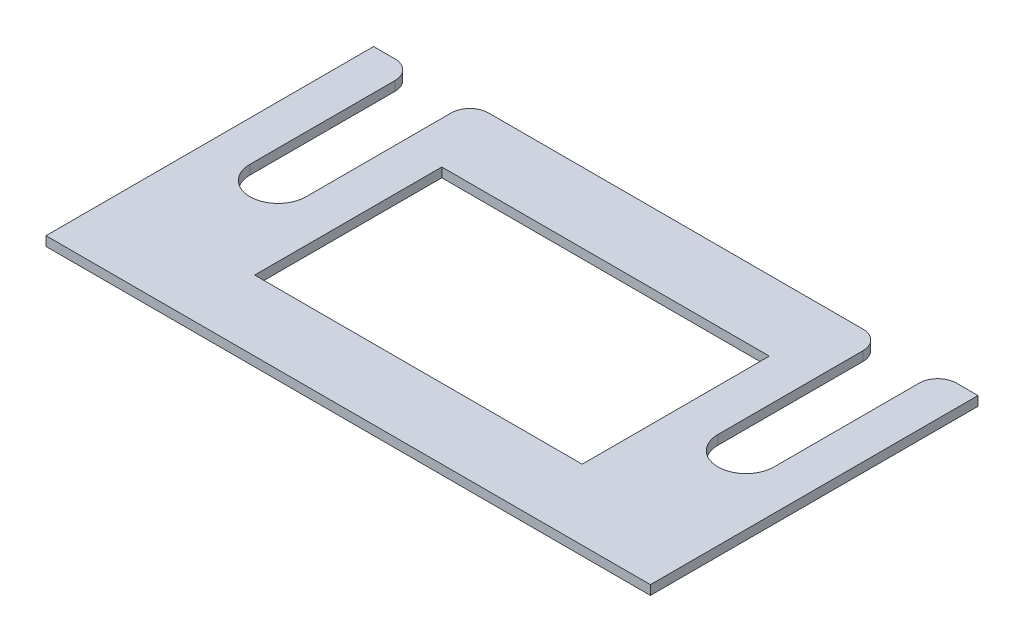
ISO-10303-21;
HEADER;
FILE_DESCRIPTION(('STEP AP214'),'2;1');
FILE_NAME('part.step','',(''),(''),'','','');
FILE_SCHEMA(('AUTOMOTIVE_DESIGN { 1 0 10303 214 1 1 1 1 }'));
ENDSEC;
DATA;
#1=APPLICATION_CONTEXT('core data for automotive mechanical design processes');
#2=APPLICATION_PROTOCOL_DEFINITION('international standard','automotive_design',2000,#1);
#3=PRODUCT_CONTEXT('',#1,'mechanical');
#4=PRODUCT('Part','Part','',(#3));
#5=PRODUCT_RELATED_PRODUCT_CATEGORY('part','',(#4));
#6=PRODUCT_DEFINITION_FORMATION('','',#4);
#7=PRODUCT_DEFINITION_CONTEXT('part definition',#1,'design');
#8=PRODUCT_DEFINITION('design','',#6,#7);
#9=PRODUCT_DEFINITION_SHAPE('','',#8);
#10=(LENGTH_UNIT() NAMED_UNIT(*) SI_UNIT(.MILLI.,.METRE.));
#11=(NAMED_UNIT(*) PLANE_ANGLE_UNIT() SI_UNIT($,.RADIAN.));
#12=(NAMED_UNIT(*) SI_UNIT($,.STERADIAN.) SOLID_ANGLE_UNIT());
#13=UNCERTAINTY_MEASURE_WITH_UNIT(LENGTH_MEASURE(1.E-05),#10,'distance_accuracy_value','');
#14=(GEOMETRIC_REPRESENTATION_CONTEXT(3) GLOBAL_UNCERTAINTY_ASSIGNED_CONTEXT((#13)) GLOBAL_UNIT_ASSIGNED_CONTEXT((#10,
#11,#12)) REPRESENTATION_CONTEXT('',''));
#15=CARTESIAN_POINT('',(0.,0.,0.));
#16=DIRECTION('',(0.,0.,1.));
#17=DIRECTION('',(1.,0.,0.));
#18=AXIS2_PLACEMENT_3D('',#15,#16,#17);
#19=CARTESIAN_POINT('',(-32.29,1.,-17.5));
#20=DIRECTION('',(0.,0.,1.));
#21=DIRECTION('',(1.,0.,0.));
#22=AXIS2_PLACEMENT_3D('',#19,#20,#21);
#23=PLANE('',#22);
#24=DIRECTION('',(-1.,0.,0.));
#25=VECTOR('',#24,1.);
#26=CARTESIAN_POINT('',(-32.29,1.,-17.5));
#27=LINE('',#26,#25);
#28=CARTESIAN_POINT('',(20.,1.,-17.5));
#29=VERTEX_POINT('',#28);
#30=CARTESIAN_POINT('',(-20.,1.,-17.5));
#31=VERTEX_POINT('',#30);
#32=EDGE_CURVE('E271',#29,#31,#27,.T.);
#33=ORIENTED_EDGE('',*,*,#32,.F.);
#34=DIRECTION('',(0.,1.,0.));
#35=VECTOR('',#34,1.);
#36=CARTESIAN_POINT('',(20.,1.,-17.5));
#37=LINE('',#36,#35);
#38=CARTESIAN_POINT('',(20.,0.,-17.5));
#39=VERTEX_POINT('',#38);
#40=EDGE_CURVE('E198',#29,#39,#37,.F.);
#41=ORIENTED_EDGE('',*,*,#40,.T.);
#42=DIRECTION('',(-1.,0.,0.));
#43=VECTOR('',#42,1.);
#44=CARTESIAN_POINT('',(-32.29,0.,-17.5));
#45=LINE('',#44,#43);
#46=CARTESIAN_POINT('',(-20.,0.,-17.5));
#47=VERTEX_POINT('',#46);
#48=EDGE_CURVE('E284',#39,#47,#45,.T.);
#49=ORIENTED_EDGE('',*,*,#48,.T.);
#50=DIRECTION('',(0.,1.,0.));
#51=VECTOR('',#50,1.);
#52=CARTESIAN_POINT('',(-20.,1.,-17.5));
#53=LINE('',#52,#51);
#54=EDGE_CURVE('E200',#47,#31,#53,.T.);
#55=ORIENTED_EDGE('',*,*,#54,.T.);
#56=EDGE_LOOP('',(#33,#41,#49,#55));
#57=FACE_BOUND('',#56,.T.);
#58=ADVANCED_FACE('F37',(#57),#23,.F.);
#59=CARTESIAN_POINT('',(32.29,0.,-17.5));
#60=VERTEX_POINT('',#59);
#61=CARTESIAN_POINT('',(30.,0.,-17.5));
#62=VERTEX_POINT('',#61);
#63=EDGE_CURVE('E280',#60,#62,#45,.T.);
#64=ORIENTED_EDGE('',*,*,#63,.T.);
#65=DIRECTION('',(0.,1.,0.));
#66=VECTOR('',#65,1.);
#67=CARTESIAN_POINT('',(30.,1.,-17.5));
#68=LINE('',#67,#66);
#69=CARTESIAN_POINT('',(30.,1.,-17.5));
#70=VERTEX_POINT('',#69);
#71=EDGE_CURVE('E224',#62,#70,#68,.T.);
#72=ORIENTED_EDGE('',*,*,#71,.T.);
#73=CARTESIAN_POINT('',(32.29,1.,-17.5));
#74=VERTEX_POINT('',#73);
#75=EDGE_CURVE('E267',#74,#70,#27,.T.);
#76=ORIENTED_EDGE('',*,*,#75,.F.);
#77=DIRECTION('',(0.,-1.,0.));
#78=VECTOR('',#77,1.);
#79=CARTESIAN_POINT('',(32.29,1.,-17.5));
#80=LINE('',#79,#78);
#81=EDGE_CURVE('E295',#74,#60,#80,.T.);
#82=ORIENTED_EDGE('',*,*,#81,.T.);
#83=EDGE_LOOP('',(#64,#72,#76,#82));
#84=FACE_BOUND('',#83,.T.);
#85=ADVANCED_FACE('F308',(#84),#23,.F.);
#86=CARTESIAN_POINT('',(0.,1.,0.));
#87=DIRECTION('',(0.,-1.,0.));
#88=DIRECTION('',(0.,0.,-1.));
#89=AXIS2_PLACEMENT_3D('',#86,#87,#88);
#90=PLANE('',#89);
#91=DIRECTION('',(-1.,0.,0.));
#92=VECTOR('',#91,1.);
#93=CARTESIAN_POINT('',(0.,1.,10.));
#94=LINE('',#93,#92);
#95=CARTESIAN_POINT('',(17.5,1.,10.));
#96=VERTEX_POINT('',#95);
#97=CARTESIAN_POINT('',(-17.5,1.,10.));
#98=VERTEX_POINT('',#97);
#99=EDGE_CURVE('E359',#96,#98,#94,.T.);
#100=ORIENTED_EDGE('',*,*,#99,.T.);
#101=DIRECTION('',(0.,0.,-1.));
#102=VECTOR('',#101,1.);
#103=CARTESIAN_POINT('',(-17.5,1.,0.));
#104=LINE('',#103,#102);
#105=CARTESIAN_POINT('',(-17.5,1.,-10.));
#106=VERTEX_POINT('',#105);
#107=EDGE_CURVE('E353',#98,#106,#104,.T.);
#108=ORIENTED_EDGE('',*,*,#107,.T.);
#109=DIRECTION('',(1.,0.,0.));
#110=VECTOR('',#109,1.);
#111=CARTESIAN_POINT('',(0.,1.,-10.));
#112=LINE('',#111,#110);
#113=CARTESIAN_POINT('',(17.5,1.,-9.99999999999999));
#114=VERTEX_POINT('',#113);
#115=EDGE_CURVE('E363',#106,#114,#112,.T.);
#116=ORIENTED_EDGE('',*,*,#115,.T.);
#117=DIRECTION('',(0.,0.,1.));
#118=VECTOR('',#117,1.);
#119=CARTESIAN_POINT('',(17.5,1.,0.));
#120=LINE('',#119,#118);
#121=EDGE_CURVE('E183',#114,#96,#120,.T.);
#122=ORIENTED_EDGE('',*,*,#121,.T.);
#123=EDGE_LOOP('',(#100,#108,#116,#122));
#124=FACE_BOUND('',#123,.T.);
#125=ORIENTED_EDGE('',*,*,#75,.T.);
#126=CARTESIAN_POINT('',(30.,1.,-15.5));
#127=DIRECTION('',(0.,-1.,0.));
#128=DIRECTION('',(0.,0.,-1.));
#129=AXIS2_PLACEMENT_3D('',#126,#127,#128);
#130=CIRCLE('',#129,2.);
#131=CARTESIAN_POINT('',(28.,1.,-15.5));
#132=VERTEX_POINT('',#131);
#133=EDGE_CURVE('E216',#70,#132,#130,.F.);
#134=ORIENTED_EDGE('',*,*,#133,.T.);
#135=DIRECTION('',(0.,0.,1.));
#136=VECTOR('',#135,1.);
#137=CARTESIAN_POINT('',(28.,1.,0.));
#138=LINE('',#137,#136);
#139=CARTESIAN_POINT('',(28.,1.00001125,0.));
#140=VERTEX_POINT('',#139);
#141=EDGE_CURVE('E225',#132,#140,#138,.T.);
#142=ORIENTED_EDGE('',*,*,#141,.T.);
#143=CARTESIAN_POINT('',(25.,1.,0.));
#144=DIRECTION('',(0.,1.,0.));
#145=DIRECTION('',(0.,0.,1.));
#146=AXIS2_PLACEMENT_3D('',#143,#144,#145);
#147=CIRCLE('',#146,3.);
#148=CARTESIAN_POINT('',(22.,1.00001125,0.));
#149=VERTEX_POINT('',#148);
#150=EDGE_CURVE('E257',#149,#140,#147,.T.);
#151=ORIENTED_EDGE('',*,*,#150,.F.);
#152=DIRECTION('',(0.,0.,-1.));
#153=VECTOR('',#152,1.);
#154=CARTESIAN_POINT('',(22.,1.,0.));
#155=LINE('',#154,#153);
#156=CARTESIAN_POINT('',(22.,1.,-15.5));
#157=VERTEX_POINT('',#156);
#158=EDGE_CURVE('E229',#149,#157,#155,.T.);
#159=ORIENTED_EDGE('',*,*,#158,.T.);
#160=CARTESIAN_POINT('',(20.,1.,-15.5));
#161=DIRECTION('',(0.,-1.,0.));
#162=DIRECTION('',(0.,0.,-1.));
#163=AXIS2_PLACEMENT_3D('',#160,#161,#162);
#164=CIRCLE('',#163,2.);
#165=EDGE_CURVE('E218',#157,#29,#164,.F.);
#166=ORIENTED_EDGE('',*,*,#165,.T.);
#167=ORIENTED_EDGE('',*,*,#32,.T.);
#168=CARTESIAN_POINT('',(-20.,1.,-15.5));
#169=DIRECTION('',(0.,-1.,0.));
#170=DIRECTION('',(0.,0.,-1.));
#171=AXIS2_PLACEMENT_3D('',#168,#169,#170);
#172=CIRCLE('',#171,2.);
#173=CARTESIAN_POINT('',(-22.,1.,-15.5));
#174=VERTEX_POINT('',#173);
#175=EDGE_CURVE('E222',#31,#174,#172,.F.);
#176=ORIENTED_EDGE('',*,*,#175,.T.);
#177=DIRECTION('',(0.,0.,1.));
#178=VECTOR('',#177,1.);
#179=CARTESIAN_POINT('',(-22.,1.,0.));
#180=LINE('',#179,#178);
#181=CARTESIAN_POINT('',(-22.,1.00001125,0.));
#182=VERTEX_POINT('',#181);
#183=EDGE_CURVE('E230',#174,#182,#180,.T.);
#184=ORIENTED_EDGE('',*,*,#183,.T.);
#185=CARTESIAN_POINT('',(-25.,1.,0.));
#186=DIRECTION('',(0.,1.,0.));
#187=DIRECTION('',(0.,0.,1.));
#188=AXIS2_PLACEMENT_3D('',#185,#186,#187);
#189=CIRCLE('',#188,3.);
#190=CARTESIAN_POINT('',(-28.,1.00001125,0.));
#191=VERTEX_POINT('',#190);
#192=EDGE_CURVE('E261',#191,#182,#189,.T.);
#193=ORIENTED_EDGE('',*,*,#192,.F.);
#194=DIRECTION('',(0.,0.,-1.));
#195=VECTOR('',#194,1.);
#196=CARTESIAN_POINT('',(-28.,1.,0.));
#197=LINE('',#196,#195);
#198=CARTESIAN_POINT('',(-28.,1.,-15.5));
#199=VERTEX_POINT('',#198);
#200=EDGE_CURVE('E228',#191,#199,#197,.T.);
#201=ORIENTED_EDGE('',*,*,#200,.T.);
#202=CARTESIAN_POINT('',(-30.,1.,-15.5));
#203=DIRECTION('',(0.,-1.,0.));
#204=DIRECTION('',(0.,0.,-1.));
#205=AXIS2_PLACEMENT_3D('',#202,#203,#204);
#206=CIRCLE('',#205,2.);
#207=CARTESIAN_POINT('',(-30.,1.,-17.5));
#208=VERTEX_POINT('',#207);
#209=EDGE_CURVE('E220',#199,#208,#206,.F.);
#210=ORIENTED_EDGE('',*,*,#209,.T.);
#211=CARTESIAN_POINT('',(-32.29,1.,-17.5));
#212=VERTEX_POINT('',#211);
#213=EDGE_CURVE('E265',#208,#212,#27,.T.);
#214=ORIENTED_EDGE('',*,*,#213,.T.);
#215=DIRECTION('',(0.,0.,1.));
#216=VECTOR('',#215,1.);
#217=CARTESIAN_POINT('',(-32.29,1.,17.5));
#218=LINE('',#217,#216);
#219=CARTESIAN_POINT('',(-32.29,1.,17.5));
#220=VERTEX_POINT('',#219);
#221=EDGE_CURVE('E270',#212,#220,#218,.T.);
#222=ORIENTED_EDGE('',*,*,#221,.T.);
#223=DIRECTION('',(1.,0.,0.));
#224=VECTOR('',#223,1.);
#225=CARTESIAN_POINT('',(-32.29,1.,17.5));
#226=LINE('',#225,#224);
#227=CARTESIAN_POINT('',(32.29,1.,17.5));
#228=VERTEX_POINT('',#227);
#229=EDGE_CURVE('E273',#220,#228,#226,.T.);
#230=ORIENTED_EDGE('',*,*,#229,.T.);
#231=DIRECTION('',(0.,0.,-1.));
#232=VECTOR('',#231,1.);
#233=CARTESIAN_POINT('',(32.29,1.,17.5));
#234=LINE('',#233,#232);
#235=EDGE_CURVE('E262',#228,#74,#234,.T.);
#236=ORIENTED_EDGE('',*,*,#235,.T.);
#237=EDGE_LOOP('',(#125,#134,#142,#151,#159,#166,#167,#176,#184,#193,#201,#210,#214,#222,#230,#236));
#238=FACE_BOUND('',#237,.T.);
#239=ADVANCED_FACE('F312',(#124,#238),#90,.F.);
#240=CARTESIAN_POINT('',(0.,0.,0.));
#241=DIRECTION('',(0.,-1.,0.));
#242=DIRECTION('',(0.,0.,-1.));
#243=AXIS2_PLACEMENT_3D('',#240,#241,#242);
#244=PLANE('',#243);
#245=DIRECTION('',(0.,0.,-1.));
#246=VECTOR('',#245,1.);
#247=CARTESIAN_POINT('',(-17.5,0.,0.));
#248=LINE('',#247,#246);
#249=CARTESIAN_POINT('',(-17.5,0.,10.));
#250=VERTEX_POINT('',#249);
#251=CARTESIAN_POINT('',(-17.5,0.,-10.));
#252=VERTEX_POINT('',#251);
#253=EDGE_CURVE('E11',#250,#252,#248,.T.);
#254=ORIENTED_EDGE('',*,*,#253,.F.);
#255=DIRECTION('',(-1.,0.,0.));
#256=VECTOR('',#255,1.);
#257=CARTESIAN_POINT('',(0.,0.,10.));
#258=LINE('',#257,#256);
#259=CARTESIAN_POINT('',(17.5,0.,10.));
#260=VERTEX_POINT('',#259);
#261=EDGE_CURVE('E45',#260,#250,#258,.T.);
#262=ORIENTED_EDGE('',*,*,#261,.F.);
#263=DIRECTION('',(0.,0.,1.));
#264=VECTOR('',#263,1.);
#265=CARTESIAN_POINT('',(17.5,0.,0.));
#266=LINE('',#265,#264);
#267=CARTESIAN_POINT('',(17.5,0.,-9.99999999999999));
#268=VERTEX_POINT('',#267);
#269=EDGE_CURVE('E175',#268,#260,#266,.T.);
#270=ORIENTED_EDGE('',*,*,#269,.F.);
#271=DIRECTION('',(1.,0.,0.));
#272=VECTOR('',#271,1.);
#273=CARTESIAN_POINT('',(0.,0.,-10.));
#274=LINE('',#273,#272);
#275=EDGE_CURVE('E170',#252,#268,#274,.T.);
#276=ORIENTED_EDGE('',*,*,#275,.F.);
#277=EDGE_LOOP('',(#254,#262,#270,#276));
#278=FACE_BOUND('',#277,.T.);
#279=DIRECTION('',(0.,0.,-1.));
#280=VECTOR('',#279,1.);
#281=CARTESIAN_POINT('',(28.,0.,0.));
#282=LINE('',#281,#280);
#283=CARTESIAN_POINT('',(28.,0.,0.));
#284=VERTEX_POINT('',#283);
#285=CARTESIAN_POINT('',(28.,0.,-15.5));
#286=VERTEX_POINT('',#285);
#287=EDGE_CURVE('E324',#284,#286,#282,.T.);
#288=ORIENTED_EDGE('',*,*,#287,.T.);
#289=CARTESIAN_POINT('',(30.,0.,-15.5));
#290=DIRECTION('',(0.,-1.,0.));
#291=DIRECTION('',(0.,0.,-1.));
#292=AXIS2_PLACEMENT_3D('',#289,#290,#291);
#293=CIRCLE('',#292,2.);
#294=EDGE_CURVE('E206',#286,#62,#293,.T.);
#295=ORIENTED_EDGE('',*,*,#294,.T.);
#296=ORIENTED_EDGE('',*,*,#63,.F.);
#297=DIRECTION('',(0.,0.,-1.));
#298=VECTOR('',#297,1.);
#299=CARTESIAN_POINT('',(32.29,0.,17.5));
#300=LINE('',#299,#298);
#301=CARTESIAN_POINT('',(32.29,0.,17.5));
#302=VERTEX_POINT('',#301);
#303=EDGE_CURVE('E276',#302,#60,#300,.T.);
#304=ORIENTED_EDGE('',*,*,#303,.F.);
#305=DIRECTION('',(1.,0.,0.));
#306=VECTOR('',#305,1.);
#307=CARTESIAN_POINT('',(-32.29,0.,17.5));
#308=LINE('',#307,#306);
#309=CARTESIAN_POINT('',(-32.29,0.,17.5));
#310=VERTEX_POINT('',#309);
#311=EDGE_CURVE('E266',#310,#302,#308,.T.);
#312=ORIENTED_EDGE('',*,*,#311,.F.);
#313=DIRECTION('',(0.,0.,1.));
#314=VECTOR('',#313,1.);
#315=CARTESIAN_POINT('',(-32.29,0.,17.5));
#316=LINE('',#315,#314);
#317=CARTESIAN_POINT('',(-32.29,0.,-17.5));
#318=VERTEX_POINT('',#317);
#319=EDGE_CURVE('E283',#318,#310,#316,.T.);
#320=ORIENTED_EDGE('',*,*,#319,.F.);
#321=CARTESIAN_POINT('',(-30.,0.,-17.5));
#322=VERTEX_POINT('',#321);
#323=EDGE_CURVE('E279',#322,#318,#45,.T.);
#324=ORIENTED_EDGE('',*,*,#323,.F.);
#325=CARTESIAN_POINT('',(-30.,0.,-15.5));
#326=DIRECTION('',(0.,-1.,0.));
#327=DIRECTION('',(0.,0.,-1.));
#328=AXIS2_PLACEMENT_3D('',#325,#326,#327);
#329=CIRCLE('',#328,2.);
#330=CARTESIAN_POINT('',(-28.,0.,-15.5));
#331=VERTEX_POINT('',#330);
#332=EDGE_CURVE('E210',#322,#331,#329,.T.);
#333=ORIENTED_EDGE('',*,*,#332,.T.);
#334=DIRECTION('',(0.,0.,1.));
#335=VECTOR('',#334,1.);
#336=CARTESIAN_POINT('',(-28.,0.,0.));
#337=LINE('',#336,#335);
#338=CARTESIAN_POINT('',(-28.,0.,0.));
#339=VERTEX_POINT('',#338);
#340=EDGE_CURVE('E242',#331,#339,#337,.T.);
#341=ORIENTED_EDGE('',*,*,#340,.T.);
#342=CARTESIAN_POINT('',(-25.,0.,0.));
#343=DIRECTION('',(0.,1.,0.));
#344=DIRECTION('',(0.,0.,1.));
#345=AXIS2_PLACEMENT_3D('',#342,#343,#344);
#346=CIRCLE('',#345,3.);
#347=CARTESIAN_POINT('',(-22.,0.,0.));
#348=VERTEX_POINT('',#347);
#349=EDGE_CURVE('E258',#339,#348,#346,.T.);
#350=ORIENTED_EDGE('',*,*,#349,.T.);
#351=DIRECTION('',(0.,0.,-1.));
#352=VECTOR('',#351,1.);
#353=CARTESIAN_POINT('',(-22.,0.,0.));
#354=LINE('',#353,#352);
#355=CARTESIAN_POINT('',(-22.,0.,-15.5));
#356=VERTEX_POINT('',#355);
#357=EDGE_CURVE('E344',#348,#356,#354,.T.);
#358=ORIENTED_EDGE('',*,*,#357,.T.);
#359=CARTESIAN_POINT('',(-20.,0.,-15.5));
#360=DIRECTION('',(0.,-1.,0.));
#361=DIRECTION('',(0.,0.,-1.));
#362=AXIS2_PLACEMENT_3D('',#359,#360,#361);
#363=CIRCLE('',#362,2.);
#364=EDGE_CURVE('E212',#356,#47,#363,.T.);
#365=ORIENTED_EDGE('',*,*,#364,.T.);
#366=ORIENTED_EDGE('',*,*,#48,.F.);
#367=CARTESIAN_POINT('',(20.,0.,-15.5));
#368=DIRECTION('',(0.,-1.,0.));
#369=DIRECTION('',(0.,0.,-1.));
#370=AXIS2_PLACEMENT_3D('',#367,#368,#369);
#371=CIRCLE('',#370,2.);
#372=CARTESIAN_POINT('',(22.,0.,-15.5));
#373=VERTEX_POINT('',#372);
#374=EDGE_CURVE('E208',#39,#373,#371,.T.);
#375=ORIENTED_EDGE('',*,*,#374,.T.);
#376=DIRECTION('',(0.,0.,1.));
#377=VECTOR('',#376,1.);
#378=CARTESIAN_POINT('',(22.,0.,0.));
#379=LINE('',#378,#377);
#380=CARTESIAN_POINT('',(22.,0.,0.));
#381=VERTEX_POINT('',#380);
#382=EDGE_CURVE('E342',#373,#381,#379,.T.);
#383=ORIENTED_EDGE('',*,*,#382,.T.);
#384=CARTESIAN_POINT('',(25.,0.,0.));
#385=DIRECTION('',(0.,1.,0.));
#386=DIRECTION('',(0.,0.,1.));
#387=AXIS2_PLACEMENT_3D('',#384,#385,#386);
#388=CIRCLE('',#387,3.);
#389=EDGE_CURVE('E254',#381,#284,#388,.T.);
#390=ORIENTED_EDGE('',*,*,#389,.T.);
#391=EDGE_LOOP('',(#288,#295,#296,#304,#312,#320,#324,#333,#341,#350,#358,#365,#366,#375,#383,#390));
#392=FACE_BOUND('',#391,.T.);
#393=ADVANCED_FACE('F188',(#278,#392),#244,.T.);
#394=CARTESIAN_POINT('',(32.29,1.,17.5));
#395=DIRECTION('',(-1.,0.,0.));
#396=DIRECTION('',(0.,0.,1.));
#397=AXIS2_PLACEMENT_3D('',#394,#395,#396);
#398=PLANE('',#397);
#399=ORIENTED_EDGE('',*,*,#303,.T.);
#400=ORIENTED_EDGE('',*,*,#81,.F.);
#401=ORIENTED_EDGE('',*,*,#235,.F.);
#402=DIRECTION('',(0.,-1.,0.));
#403=VECTOR('',#402,1.);
#404=CARTESIAN_POINT('',(32.29,1.,17.5));
#405=LINE('',#404,#403);
#406=EDGE_CURVE('E275',#228,#302,#405,.T.);
#407=ORIENTED_EDGE('',*,*,#406,.T.);
#408=EDGE_LOOP('',(#399,#400,#401,#407));
#409=FACE_BOUND('',#408,.T.);
#410=ADVANCED_FACE('F319',(#409),#398,.F.);
#411=ORIENTED_EDGE('',*,*,#213,.F.);
#412=DIRECTION('',(0.,1.,0.));
#413=VECTOR('',#412,1.);
#414=CARTESIAN_POINT('',(-30.,1.,-17.5));
#415=LINE('',#414,#413);
#416=EDGE_CURVE('E193',#208,#322,#415,.F.);
#417=ORIENTED_EDGE('',*,*,#416,.T.);
#418=ORIENTED_EDGE('',*,*,#323,.T.);
#419=DIRECTION('',(0.,-1.,0.));
#420=VECTOR('',#419,1.);
#421=CARTESIAN_POINT('',(-32.29,1.,-17.5));
#422=LINE('',#421,#420);
#423=EDGE_CURVE('E292',#212,#318,#422,.T.);
#424=ORIENTED_EDGE('',*,*,#423,.F.);
#425=EDGE_LOOP('',(#411,#417,#418,#424));
#426=FACE_BOUND('',#425,.T.);
#427=ADVANCED_FACE('F383',(#426),#23,.F.);
#428=CARTESIAN_POINT('',(-32.29,1.,17.5));
#429=DIRECTION('',(1.,0.,0.));
#430=DIRECTION('',(0.,0.,-1.));
#431=AXIS2_PLACEMENT_3D('',#428,#429,#430);
#432=PLANE('',#431);
#433=ORIENTED_EDGE('',*,*,#319,.T.);
#434=DIRECTION('',(0.,-1.,0.));
#435=VECTOR('',#434,1.);
#436=CARTESIAN_POINT('',(-32.29,1.,17.5));
#437=LINE('',#436,#435);
#438=EDGE_CURVE('E289',#220,#310,#437,.T.);
#439=ORIENTED_EDGE('',*,*,#438,.F.);
#440=ORIENTED_EDGE('',*,*,#221,.F.);
#441=ORIENTED_EDGE('',*,*,#423,.T.);
#442=EDGE_LOOP('',(#433,#439,#440,#441));
#443=FACE_BOUND('',#442,.T.);
#444=ADVANCED_FACE('F393',(#443),#432,.F.);
#445=CARTESIAN_POINT('',(-32.29,1.,17.5));
#446=DIRECTION('',(0.,0.,-1.));
#447=DIRECTION('',(-1.,0.,0.));
#448=AXIS2_PLACEMENT_3D('',#445,#446,#447);
#449=PLANE('',#448);
#450=ORIENTED_EDGE('',*,*,#311,.T.);
#451=ORIENTED_EDGE('',*,*,#406,.F.);
#452=ORIENTED_EDGE('',*,*,#229,.F.);
#453=ORIENTED_EDGE('',*,*,#438,.T.);
#454=EDGE_LOOP('',(#450,#451,#452,#453));
#455=FACE_BOUND('',#454,.T.);
#456=ADVANCED_FACE('F399',(#455),#449,.F.);
#457=CARTESIAN_POINT('',(-25.,1.,0.));
#458=DIRECTION('',(0.,-1.,0.));
#459=DIRECTION('',(0.,0.,-1.));
#460=AXIS2_PLACEMENT_3D('',#457,#458,#459);
#461=CYLINDRICAL_SURFACE('',#460,3.);
#462=DIRECTION('',(0.,1.,0.));
#463=VECTOR('',#462,1.);
#464=CARTESIAN_POINT('',(-22.,0.,0.));
#465=LINE('',#464,#463);
#466=EDGE_CURVE('E241',#348,#182,#465,.T.);
#467=ORIENTED_EDGE('',*,*,#466,.F.);
#468=ORIENTED_EDGE('',*,*,#349,.F.);
#469=DIRECTION('',(0.,1.,0.));
#470=VECTOR('',#469,1.);
#471=CARTESIAN_POINT('',(-28.,0.,0.));
#472=LINE('',#471,#470);
#473=EDGE_CURVE('E238',#339,#191,#472,.T.);
#474=ORIENTED_EDGE('',*,*,#473,.T.);
#475=ORIENTED_EDGE('',*,*,#192,.T.);
#476=EDGE_LOOP('',(#467,#468,#474,#475));
#477=FACE_BOUND('',#476,.T.);
#478=ADVANCED_FACE('F418',(#477),#461,.F.);
#479=CARTESIAN_POINT('',(25.,1.,0.));
#480=DIRECTION('',(0.,-1.,0.));
#481=DIRECTION('',(0.,0.,-1.));
#482=AXIS2_PLACEMENT_3D('',#479,#480,#481);
#483=CYLINDRICAL_SURFACE('',#482,3.);
#484=DIRECTION('',(0.,1.,0.));
#485=VECTOR('',#484,1.);
#486=CARTESIAN_POINT('',(28.,0.,0.));
#487=LINE('',#486,#485);
#488=EDGE_CURVE('E331',#284,#140,#487,.T.);
#489=ORIENTED_EDGE('',*,*,#488,.F.);
#490=ORIENTED_EDGE('',*,*,#389,.F.);
#491=DIRECTION('',(0.,1.,0.));
#492=VECTOR('',#491,1.);
#493=CARTESIAN_POINT('',(22.,0.,0.));
#494=LINE('',#493,#492);
#495=EDGE_CURVE('E339',#381,#149,#494,.T.);
#496=ORIENTED_EDGE('',*,*,#495,.T.);
#497=ORIENTED_EDGE('',*,*,#150,.T.);
#498=EDGE_LOOP('',(#489,#490,#496,#497));
#499=FACE_BOUND('',#498,.T.);
#500=ADVANCED_FACE('F336',(#499),#483,.F.);
#501=CARTESIAN_POINT('',(22.,0.,0.));
#502=DIRECTION('',(-1.,0.,0.));
#503=DIRECTION('',(0.,0.,1.));
#504=AXIS2_PLACEMENT_3D('',#501,#502,#503);
#505=PLANE('',#504);
#506=ORIENTED_EDGE('',*,*,#382,.F.);
#507=DIRECTION('',(0.,1.,0.));
#508=VECTOR('',#507,1.);
#509=CARTESIAN_POINT('',(22.,0.,-15.5));
#510=LINE('',#509,#508);
#511=EDGE_CURVE('E203',#373,#157,#510,.T.);
#512=ORIENTED_EDGE('',*,*,#511,.T.);
#513=ORIENTED_EDGE('',*,*,#158,.F.);
#514=ORIENTED_EDGE('',*,*,#495,.F.);
#515=EDGE_LOOP('',(#506,#512,#513,#514));
#516=FACE_BOUND('',#515,.T.);
#517=ADVANCED_FACE('F433',(#516),#505,.F.);
#518=CARTESIAN_POINT('',(28.,0.,0.));
#519=DIRECTION('',(1.,0.,0.));
#520=DIRECTION('',(0.,0.,-1.));
#521=AXIS2_PLACEMENT_3D('',#518,#519,#520);
#522=PLANE('',#521);
#523=ORIENTED_EDGE('',*,*,#141,.F.);
#524=DIRECTION('',(0.,1.,0.));
#525=VECTOR('',#524,1.);
#526=CARTESIAN_POINT('',(28.,0.,-15.5));
#527=LINE('',#526,#525);
#528=EDGE_CURVE('E214',#132,#286,#527,.F.);
#529=ORIENTED_EDGE('',*,*,#528,.T.);
#530=ORIENTED_EDGE('',*,*,#287,.F.);
#531=ORIENTED_EDGE('',*,*,#488,.T.);
#532=EDGE_LOOP('',(#523,#529,#530,#531));
#533=FACE_BOUND('',#532,.T.);
#534=ADVANCED_FACE('F328',(#533),#522,.F.);
#535=CARTESIAN_POINT('',(-28.,0.,0.));
#536=DIRECTION('',(-1.,0.,0.));
#537=DIRECTION('',(0.,0.,1.));
#538=AXIS2_PLACEMENT_3D('',#535,#536,#537);
#539=PLANE('',#538);
#540=ORIENTED_EDGE('',*,*,#340,.F.);
#541=DIRECTION('',(0.,1.,0.));
#542=VECTOR('',#541,1.);
#543=CARTESIAN_POINT('',(-28.,0.,-15.5));
#544=LINE('',#543,#542);
#545=EDGE_CURVE('E195',#331,#199,#544,.T.);
#546=ORIENTED_EDGE('',*,*,#545,.T.);
#547=ORIENTED_EDGE('',*,*,#200,.F.);
#548=ORIENTED_EDGE('',*,*,#473,.F.);
#549=EDGE_LOOP('',(#540,#546,#547,#548));
#550=FACE_BOUND('',#549,.T.);
#551=ADVANCED_FACE('F413',(#550),#539,.F.);
#552=CARTESIAN_POINT('',(-22.,0.,0.));
#553=DIRECTION('',(1.,0.,0.));
#554=DIRECTION('',(0.,0.,-1.));
#555=AXIS2_PLACEMENT_3D('',#552,#553,#554);
#556=PLANE('',#555);
#557=ORIENTED_EDGE('',*,*,#183,.F.);
#558=DIRECTION('',(0.,1.,0.));
#559=VECTOR('',#558,1.);
#560=CARTESIAN_POINT('',(-22.,0.,-15.5));
#561=LINE('',#560,#559);
#562=EDGE_CURVE('E176',#174,#356,#561,.F.);
#563=ORIENTED_EDGE('',*,*,#562,.T.);
#564=ORIENTED_EDGE('',*,*,#357,.F.);
#565=ORIENTED_EDGE('',*,*,#466,.T.);
#566=EDGE_LOOP('',(#557,#563,#564,#565));
#567=FACE_BOUND('',#566,.T.);
#568=ADVANCED_FACE('F450',(#567),#556,.F.);
#569=CARTESIAN_POINT('',(30.,1.,-15.5));
#570=DIRECTION('',(0.,1.,0.));
#571=DIRECTION('',(0.,0.,1.));
#572=AXIS2_PLACEMENT_3D('',#569,#570,#571);
#573=CYLINDRICAL_SURFACE('',#572,2.);
#574=ORIENTED_EDGE('',*,*,#294,.F.);
#575=ORIENTED_EDGE('',*,*,#528,.F.);
#576=ORIENTED_EDGE('',*,*,#133,.F.);
#577=ORIENTED_EDGE('',*,*,#71,.F.);
#578=EDGE_LOOP('',(#574,#575,#576,#577));
#579=FACE_BOUND('',#578,.T.);
#580=ADVANCED_FACE('F326',(#579),#573,.T.);
#581=CARTESIAN_POINT('',(20.,0.,-15.5));
#582=DIRECTION('',(0.,1.,0.));
#583=DIRECTION('',(0.,0.,1.));
#584=AXIS2_PLACEMENT_3D('',#581,#582,#583);
#585=CYLINDRICAL_SURFACE('',#584,2.);
#586=ORIENTED_EDGE('',*,*,#374,.F.);
#587=ORIENTED_EDGE('',*,*,#40,.F.);
#588=ORIENTED_EDGE('',*,*,#165,.F.);
#589=ORIENTED_EDGE('',*,*,#511,.F.);
#590=EDGE_LOOP('',(#586,#587,#588,#589));
#591=FACE_BOUND('',#590,.T.);
#592=ADVANCED_FACE('F432',(#591),#585,.T.);
#593=CARTESIAN_POINT('',(-30.,0.,-15.5));
#594=DIRECTION('',(0.,1.,0.));
#595=DIRECTION('',(0.,0.,1.));
#596=AXIS2_PLACEMENT_3D('',#593,#594,#595);
#597=CYLINDRICAL_SURFACE('',#596,2.);
#598=ORIENTED_EDGE('',*,*,#332,.F.);
#599=ORIENTED_EDGE('',*,*,#416,.F.);
#600=ORIENTED_EDGE('',*,*,#209,.F.);
#601=ORIENTED_EDGE('',*,*,#545,.F.);
#602=EDGE_LOOP('',(#598,#599,#600,#601));
#603=FACE_BOUND('',#602,.T.);
#604=ADVANCED_FACE('F408',(#603),#597,.T.);
#605=CARTESIAN_POINT('',(-20.,1.,-15.5));
#606=DIRECTION('',(0.,1.,0.));
#607=DIRECTION('',(0.,0.,1.));
#608=AXIS2_PLACEMENT_3D('',#605,#606,#607);
#609=CYLINDRICAL_SURFACE('',#608,2.);
#610=ORIENTED_EDGE('',*,*,#364,.F.);
#611=ORIENTED_EDGE('',*,*,#562,.F.);
#612=ORIENTED_EDGE('',*,*,#175,.F.);
#613=ORIENTED_EDGE('',*,*,#54,.F.);
#614=EDGE_LOOP('',(#610,#611,#612,#613));
#615=FACE_BOUND('',#614,.T.);
#616=ADVANCED_FACE('F39',(#615),#609,.T.);
#617=CARTESIAN_POINT('',(-17.5,1.0001425,-10.));
#618=DIRECTION('',(-1.,0.,0.));
#619=DIRECTION('',(0.,0.,1.));
#620=AXIS2_PLACEMENT_3D('',#617,#618,#619);
#621=PLANE('',#620);
#622=DIRECTION('',(0.,-1.,0.));
#623=VECTOR('',#622,1.);
#624=CARTESIAN_POINT('',(-17.5,1.0001425,10.));
#625=LINE('',#624,#623);
#626=EDGE_CURVE('E365',#98,#250,#625,.T.);
#627=ORIENTED_EDGE('',*,*,#626,.T.);
#628=ORIENTED_EDGE('',*,*,#253,.T.);
#629=DIRECTION('',(0.,-1.,0.));
#630=VECTOR('',#629,1.);
#631=CARTESIAN_POINT('',(-17.5,1.0001425,-10.));
#632=LINE('',#631,#630);
#633=EDGE_CURVE('E57',#106,#252,#632,.T.);
#634=ORIENTED_EDGE('',*,*,#633,.F.);
#635=ORIENTED_EDGE('',*,*,#107,.F.);
#636=EDGE_LOOP('',(#627,#628,#634,#635));
#637=FACE_BOUND('',#636,.T.);
#638=ADVANCED_FACE('F371',(#637),#621,.F.);
#639=CARTESIAN_POINT('',(17.5,1.0001425,10.));
#640=DIRECTION('',(0.,0.,1.));
#641=DIRECTION('',(1.,0.,0.));
#642=AXIS2_PLACEMENT_3D('',#639,#640,#641);
#643=PLANE('',#642);
#644=DIRECTION('',(0.,-1.,0.));
#645=VECTOR('',#644,1.);
#646=CARTESIAN_POINT('',(17.5,1.0001425,10.));
#647=LINE('',#646,#645);
#648=EDGE_CURVE('E185',#96,#260,#647,.T.);
#649=ORIENTED_EDGE('',*,*,#648,.T.);
#650=ORIENTED_EDGE('',*,*,#261,.T.);
#651=ORIENTED_EDGE('',*,*,#626,.F.);
#652=ORIENTED_EDGE('',*,*,#99,.F.);
#653=EDGE_LOOP('',(#649,#650,#651,#652));
#654=FACE_BOUND('',#653,.T.);
#655=ADVANCED_FACE('F373',(#654),#643,.F.);
#656=CARTESIAN_POINT('',(17.5,1.0001425,-9.99999999999999));
#657=DIRECTION('',(1.,0.,0.));
#658=DIRECTION('',(0.,0.,-1.));
#659=AXIS2_PLACEMENT_3D('',#656,#657,#658);
#660=PLANE('',#659);
#661=DIRECTION('',(0.,-1.,0.));
#662=VECTOR('',#661,1.);
#663=CARTESIAN_POINT('',(17.5,1.0001425,-9.99999999999999));
#664=LINE('',#663,#662);
#665=EDGE_CURVE('E52',#114,#268,#664,.T.);
#666=ORIENTED_EDGE('',*,*,#665,.T.);
#667=ORIENTED_EDGE('',*,*,#269,.T.);
#668=ORIENTED_EDGE('',*,*,#648,.F.);
#669=ORIENTED_EDGE('',*,*,#121,.F.);
#670=EDGE_LOOP('',(#666,#667,#668,#669));
#671=FACE_BOUND('',#670,.T.);
#672=ADVANCED_FACE('F179',(#671),#660,.F.);
#673=CARTESIAN_POINT('',(17.5,1.0001425,-9.99999999999999));
#674=DIRECTION('',(0.,0.,-1.));
#675=DIRECTION('',(-1.,0.,0.));
#676=AXIS2_PLACEMENT_3D('',#673,#674,#675);
#677=PLANE('',#676);
#678=ORIENTED_EDGE('',*,*,#633,.T.);
#679=ORIENTED_EDGE('',*,*,#275,.T.);
#680=ORIENTED_EDGE('',*,*,#665,.F.);
#681=ORIENTED_EDGE('',*,*,#115,.F.);
#682=EDGE_LOOP('',(#678,#679,#680,#681));
#683=FACE_BOUND('',#682,.T.);
#684=ADVANCED_FACE('F171',(#683),#677,.F.);
#685=CLOSED_SHELL('',(#58,#85,#239,#393,#410,#427,#444,#456,#478,#500,#517,#534,#551,#568,#580,
#592,#604,#616,#638,#655,#672,#684));
#686=MANIFOLD_SOLID_BREP('B2',#685);
#687=ADVANCED_BREP_SHAPE_REPRESENTATION('',(#18,#686),#14);
#688=SHAPE_DEFINITION_REPRESENTATION(#9,#687);
ENDSEC;
END-ISO-10303-21;
